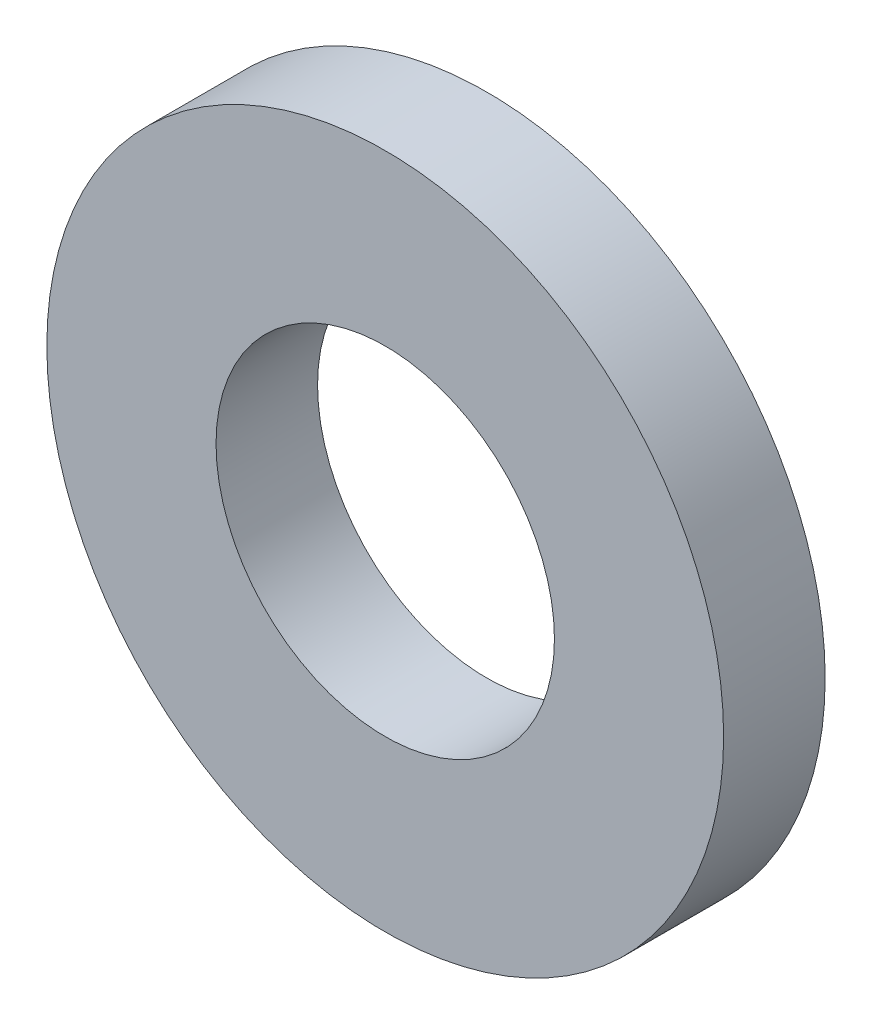
ISO-10303-21;
HEADER;
FILE_DESCRIPTION(('STEP AP214'),'2;1');
FILE_NAME('part.step','',(''),(''),'','','');
FILE_SCHEMA(('AUTOMOTIVE_DESIGN { 1 0 10303 214 1 1 1 1 }'));
ENDSEC;
DATA;
#1=APPLICATION_CONTEXT('core data for automotive mechanical design processes');
#2=APPLICATION_PROTOCOL_DEFINITION('international standard','automotive_design',2000,#1);
#3=PRODUCT_CONTEXT('',#1,'mechanical');
#4=PRODUCT('Part','Part','',(#3));
#5=PRODUCT_RELATED_PRODUCT_CATEGORY('part','',(#4));
#6=PRODUCT_DEFINITION_FORMATION('','',#4);
#7=PRODUCT_DEFINITION_CONTEXT('part definition',#1,'design');
#8=PRODUCT_DEFINITION('design','',#6,#7);
#9=PRODUCT_DEFINITION_SHAPE('','',#8);
#10=(LENGTH_UNIT() NAMED_UNIT(*) SI_UNIT(.MILLI.,.METRE.));
#11=(NAMED_UNIT(*) PLANE_ANGLE_UNIT() SI_UNIT($,.RADIAN.));
#12=(NAMED_UNIT(*) SI_UNIT($,.STERADIAN.) SOLID_ANGLE_UNIT());
#13=UNCERTAINTY_MEASURE_WITH_UNIT(LENGTH_MEASURE(1.E-05),#10,'distance_accuracy_value','');
#14=(GEOMETRIC_REPRESENTATION_CONTEXT(3) GLOBAL_UNCERTAINTY_ASSIGNED_CONTEXT((#13)) GLOBAL_UNIT_ASSIGNED_CONTEXT((#10,
#11,#12)) REPRESENTATION_CONTEXT('',''));
#15=CARTESIAN_POINT('',(0.,0.,0.));
#16=DIRECTION('',(0.,0.,1.));
#17=DIRECTION('',(1.,0.,0.));
#18=AXIS2_PLACEMENT_3D('',#15,#16,#17);
#19=CARTESIAN_POINT('',(0.,0.,1.2));
#20=DIRECTION('',(0.,0.,1.));
#21=DIRECTION('',(1.,0.,0.));
#22=AXIS2_PLACEMENT_3D('',#19,#20,#21);
#23=PLANE('',#22);
#24=CARTESIAN_POINT('',(0.,0.,1.2));
#25=DIRECTION('',(0.,0.,1.));
#26=DIRECTION('',(1.,0.,0.));
#27=AXIS2_PLACEMENT_3D('',#24,#25,#26);
#28=CIRCLE('',#27,4.);
#29=CARTESIAN_POINT('',(4.,0.,1.2));
#30=VERTEX_POINT('',#29);
#31=EDGE_CURVE('E10',#30,#30,#28,.T.);
#32=ORIENTED_EDGE('',*,*,#31,.T.);
#33=EDGE_LOOP('',(#32));
#34=FACE_BOUND('',#33,.T.);
#35=CARTESIAN_POINT('',(0.,0.,1.2));
#36=DIRECTION('',(0.,0.,1.));
#37=DIRECTION('',(1.,0.,0.));
#38=AXIS2_PLACEMENT_3D('',#35,#36,#37);
#39=CIRCLE('',#38,2.);
#40=CARTESIAN_POINT('',(2.,0.,1.2));
#41=VERTEX_POINT('',#40);
#42=EDGE_CURVE('E46',#41,#41,#39,.T.);
#43=ORIENTED_EDGE('',*,*,#42,.F.);
#44=EDGE_LOOP('',(#43));
#45=FACE_BOUND('',#44,.T.);
#46=ADVANCED_FACE('F35',(#34,#45),#23,.T.);
#47=CARTESIAN_POINT('',(0.,0.,0.));
#48=DIRECTION('',(0.,0.,1.));
#49=DIRECTION('',(1.,0.,0.));
#50=AXIS2_PLACEMENT_3D('',#47,#48,#49);
#51=PLANE('',#50);
#52=CARTESIAN_POINT('',(0.,0.,0.));
#53=DIRECTION('',(0.,0.,1.));
#54=DIRECTION('',(1.,0.,0.));
#55=AXIS2_PLACEMENT_3D('',#52,#53,#54);
#56=CIRCLE('',#55,4.);
#57=CARTESIAN_POINT('',(4.,0.,0.));
#58=VERTEX_POINT('',#57);
#59=EDGE_CURVE('E39',#58,#58,#56,.T.);
#60=ORIENTED_EDGE('',*,*,#59,.F.);
#61=EDGE_LOOP('',(#60));
#62=FACE_BOUND('',#61,.T.);
#63=CARTESIAN_POINT('',(0.,0.,0.));
#64=DIRECTION('',(0.,0.,1.));
#65=DIRECTION('',(1.,0.,0.));
#66=AXIS2_PLACEMENT_3D('',#63,#64,#65);
#67=CIRCLE('',#66,2.);
#68=CARTESIAN_POINT('',(2.,0.,0.));
#69=VERTEX_POINT('',#68);
#70=EDGE_CURVE('E48',#69,#69,#67,.T.);
#71=ORIENTED_EDGE('',*,*,#70,.T.);
#72=EDGE_LOOP('',(#71));
#73=FACE_BOUND('',#72,.T.);
#74=ADVANCED_FACE('F58',(#62,#73),#51,.F.);
#75=CARTESIAN_POINT('',(0.,0.,1.2));
#76=DIRECTION('',(0.,0.,-1.));
#77=DIRECTION('',(-1.,0.,0.));
#78=AXIS2_PLACEMENT_3D('',#75,#76,#77);
#79=CYLINDRICAL_SURFACE('',#78,4.);
#80=ORIENTED_EDGE('',*,*,#31,.F.);
#81=EDGE_LOOP('',(#80));
#82=FACE_BOUND('',#81,.T.);
#83=ORIENTED_EDGE('',*,*,#59,.T.);
#84=EDGE_LOOP('',(#83));
#85=FACE_BOUND('',#84,.T.);
#86=ADVANCED_FACE('F37',(#82,#85),#79,.T.);
#87=CARTESIAN_POINT('',(0.,0.,1.2));
#88=DIRECTION('',(0.,0.,-1.));
#89=DIRECTION('',(-1.,0.,0.));
#90=AXIS2_PLACEMENT_3D('',#87,#88,#89);
#91=CYLINDRICAL_SURFACE('',#90,2.);
#92=ORIENTED_EDGE('',*,*,#42,.T.);
#93=EDGE_LOOP('',(#92));
#94=FACE_BOUND('',#93,.T.);
#95=ORIENTED_EDGE('',*,*,#70,.F.);
#96=EDGE_LOOP('',(#95));
#97=FACE_BOUND('',#96,.T.);
#98=ADVANCED_FACE('F54',(#94,#97),#91,.F.);
#99=CLOSED_SHELL('',(#46,#74,#86,#98));
#100=MANIFOLD_SOLID_BREP('B2',#99);
#101=ADVANCED_BREP_SHAPE_REPRESENTATION('',(#18,#100),#14);
#102=SHAPE_DEFINITION_REPRESENTATION(#9,#101);
ENDSEC;
END-ISO-10303-21;
